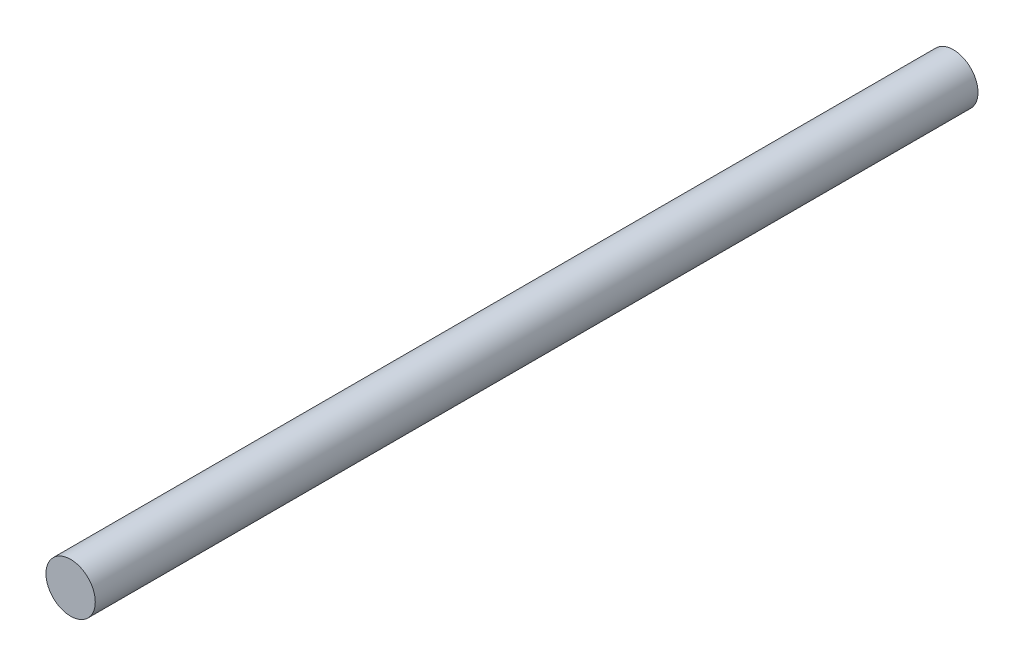
ISO-10303-21;
HEADER;
FILE_DESCRIPTION(('STEP AP214'),'2;1');
FILE_NAME('part.step','',(''),(''),'','','');
FILE_SCHEMA(('AUTOMOTIVE_DESIGN { 1 0 10303 214 1 1 1 1 }'));
ENDSEC;
DATA;
#1=APPLICATION_CONTEXT('core data for automotive mechanical design processes');
#2=APPLICATION_PROTOCOL_DEFINITION('international standard','automotive_design',2000,#1);
#3=PRODUCT_CONTEXT('',#1,'mechanical');
#4=PRODUCT('Part','Part','',(#3));
#5=PRODUCT_RELATED_PRODUCT_CATEGORY('part','',(#4));
#6=PRODUCT_DEFINITION_FORMATION('','',#4);
#7=PRODUCT_DEFINITION_CONTEXT('part definition',#1,'design');
#8=PRODUCT_DEFINITION('design','',#6,#7);
#9=PRODUCT_DEFINITION_SHAPE('','',#8);
#10=(LENGTH_UNIT() NAMED_UNIT(*) SI_UNIT(.MILLI.,.METRE.));
#11=(NAMED_UNIT(*) PLANE_ANGLE_UNIT() SI_UNIT($,.RADIAN.));
#12=(NAMED_UNIT(*) SI_UNIT($,.STERADIAN.) SOLID_ANGLE_UNIT());
#13=UNCERTAINTY_MEASURE_WITH_UNIT(LENGTH_MEASURE(1.E-05),#10,'distance_accuracy_value','');
#14=(GEOMETRIC_REPRESENTATION_CONTEXT(3) GLOBAL_UNCERTAINTY_ASSIGNED_CONTEXT((#13)) GLOBAL_UNIT_ASSIGNED_CONTEXT((#10,
#11,#12)) REPRESENTATION_CONTEXT('',''));
#15=CARTESIAN_POINT('',(0.,0.,0.));
#16=DIRECTION('',(0.,0.,1.));
#17=DIRECTION('',(1.,0.,0.));
#18=AXIS2_PLACEMENT_3D('',#15,#16,#17);
#19=CARTESIAN_POINT('',(0.,0.,170.));
#20=DIRECTION('',(0.,0.,-1.));
#21=DIRECTION('',(-1.,0.,0.));
#22=AXIS2_PLACEMENT_3D('',#19,#20,#21);
#23=CYLINDRICAL_SURFACE('',#22,4.75);
#24=CARTESIAN_POINT('',(0.,0.,170.));
#25=DIRECTION('',(0.,0.,1.));
#26=DIRECTION('',(1.,0.,0.));
#27=AXIS2_PLACEMENT_3D('',#24,#25,#26);
#28=CIRCLE('',#27,4.75);
#29=CARTESIAN_POINT('',(4.75,0.,170.));
#30=VERTEX_POINT('',#29);
#31=EDGE_CURVE('E10',#30,#30,#28,.T.);
#32=ORIENTED_EDGE('',*,*,#31,.F.);
#33=EDGE_LOOP('',(#32));
#34=FACE_BOUND('',#33,.T.);
#35=CARTESIAN_POINT('',(0.,0.,0.));
#36=DIRECTION('',(0.,0.,1.));
#37=DIRECTION('',(1.,0.,0.));
#38=AXIS2_PLACEMENT_3D('',#35,#36,#37);
#39=CIRCLE('',#38,4.75);
#40=CARTESIAN_POINT('',(4.75,0.,0.));
#41=VERTEX_POINT('',#40);
#42=EDGE_CURVE('E34',#41,#41,#39,.T.);
#43=ORIENTED_EDGE('',*,*,#42,.T.);
#44=EDGE_LOOP('',(#43));
#45=FACE_BOUND('',#44,.T.);
#46=ADVANCED_FACE('F31',(#34,#45),#23,.T.);
#47=CARTESIAN_POINT('',(0.,0.,170.));
#48=DIRECTION('',(0.,0.,1.));
#49=DIRECTION('',(1.,0.,0.));
#50=AXIS2_PLACEMENT_3D('',#47,#48,#49);
#51=PLANE('',#50);
#52=ORIENTED_EDGE('',*,*,#31,.T.);
#53=EDGE_LOOP('',(#52));
#54=FACE_BOUND('',#53,.T.);
#55=ADVANCED_FACE('F46',(#54),#51,.T.);
#56=CARTESIAN_POINT('',(0.,0.,0.));
#57=DIRECTION('',(0.,0.,1.));
#58=DIRECTION('',(1.,0.,0.));
#59=AXIS2_PLACEMENT_3D('',#56,#57,#58);
#60=PLANE('',#59);
#61=ORIENTED_EDGE('',*,*,#42,.F.);
#62=EDGE_LOOP('',(#61));
#63=FACE_BOUND('',#62,.T.);
#64=ADVANCED_FACE('F44',(#63),#60,.F.);
#65=CLOSED_SHELL('',(#46,#55,#64));
#66=MANIFOLD_SOLID_BREP('B2',#65);
#67=ADVANCED_BREP_SHAPE_REPRESENTATION('',(#18,#66),#14);
#68=SHAPE_DEFINITION_REPRESENTATION(#9,#67);
ENDSEC;
END-ISO-10303-21;
